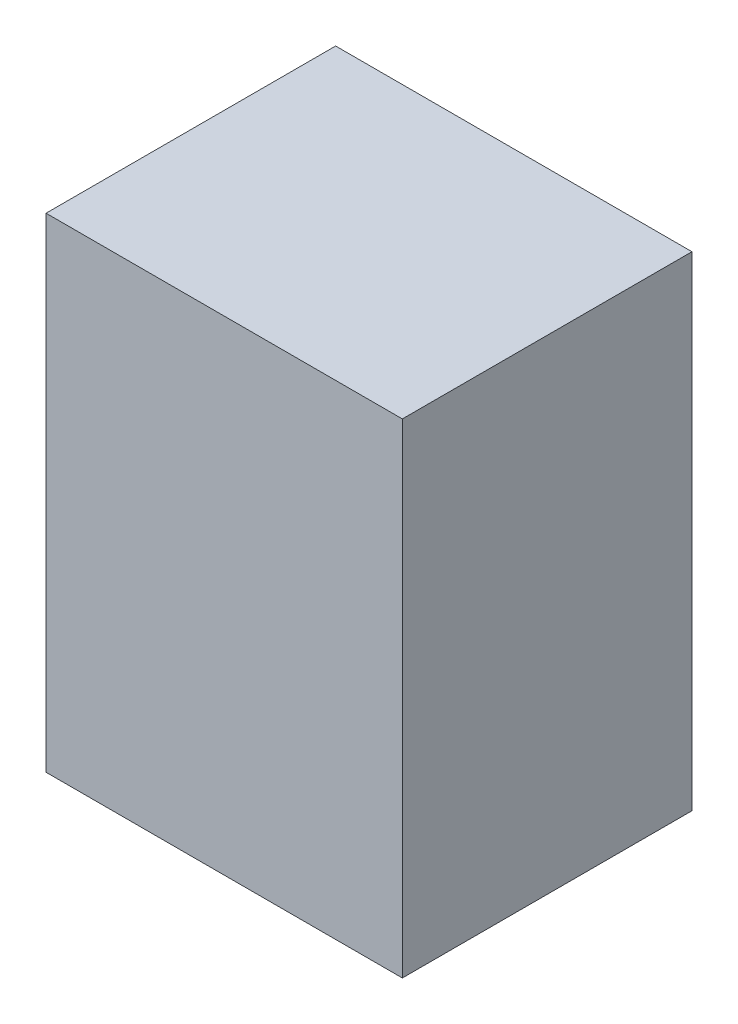
ISO-10303-21;
HEADER;
FILE_DESCRIPTION(('STEP AP214'),'2;1');
FILE_NAME('part.step','',(''),(''),'','','');
FILE_SCHEMA(('AUTOMOTIVE_DESIGN { 1 0 10303 214 1 1 1 1 }'));
ENDSEC;
DATA;
#1=APPLICATION_CONTEXT('core data for automotive mechanical design processes');
#2=APPLICATION_PROTOCOL_DEFINITION('international standard','automotive_design',2000,#1);
#3=PRODUCT_CONTEXT('',#1,'mechanical');
#4=PRODUCT('Part','Part','',(#3));
#5=PRODUCT_RELATED_PRODUCT_CATEGORY('part','',(#4));
#6=PRODUCT_DEFINITION_FORMATION('','',#4);
#7=PRODUCT_DEFINITION_CONTEXT('part definition',#1,'design');
#8=PRODUCT_DEFINITION('design','',#6,#7);
#9=PRODUCT_DEFINITION_SHAPE('','',#8);
#10=(LENGTH_UNIT() NAMED_UNIT(*) SI_UNIT(.MILLI.,.METRE.));
#11=(NAMED_UNIT(*) PLANE_ANGLE_UNIT() SI_UNIT($,.RADIAN.));
#12=(NAMED_UNIT(*) SI_UNIT($,.STERADIAN.) SOLID_ANGLE_UNIT());
#13=UNCERTAINTY_MEASURE_WITH_UNIT(LENGTH_MEASURE(1.E-05),#10,'distance_accuracy_value','');
#14=(GEOMETRIC_REPRESENTATION_CONTEXT(3) GLOBAL_UNCERTAINTY_ASSIGNED_CONTEXT((#13)) GLOBAL_UNIT_ASSIGNED_CONTEXT((#10,
#11,#12)) REPRESENTATION_CONTEXT('',''));
#15=CARTESIAN_POINT('',(0.,0.,0.));
#16=DIRECTION('',(0.,0.,1.));
#17=DIRECTION('',(1.,0.,0.));
#18=AXIS2_PLACEMENT_3D('',#15,#16,#17);
#19=CARTESIAN_POINT('',(7.86450000000038,-65.45,7.25));
#20=DIRECTION('',(1.,0.,0.));
#21=DIRECTION('',(0.,1.,0.));
#22=AXIS2_PLACEMENT_3D('',#19,#20,#21);
#23=PLANE('',#22);
#24=DIRECTION('',(0.,-1.,0.));
#25=VECTOR('',#24,1.);
#26=CARTESIAN_POINT('',(7.86450000000038,-65.45,0.));
#27=LINE('',#26,#25);
#28=CARTESIAN_POINT('',(7.86450000000038,-65.45,0.));
#29=VERTEX_POINT('',#28);
#30=CARTESIAN_POINT('',(7.86450000000038,-77.5714301256037,0.));
#31=VERTEX_POINT('',#30);
#32=EDGE_CURVE('E128',#29,#31,#27,.T.);
#33=ORIENTED_EDGE('',*,*,#32,.T.);
#34=DIRECTION('',(0.,0.,-1.));
#35=VECTOR('',#34,1.);
#36=CARTESIAN_POINT('',(7.86450000000038,-77.5714301256037,7.25));
#37=LINE('',#36,#35);
#38=CARTESIAN_POINT('',(7.86450000000038,-77.5714301256037,7.25));
#39=VERTEX_POINT('',#38);
#40=EDGE_CURVE('E11',#39,#31,#37,.T.);
#41=ORIENTED_EDGE('',*,*,#40,.F.);
#42=DIRECTION('',(0.,-1.,0.));
#43=VECTOR('',#42,1.);
#44=CARTESIAN_POINT('',(7.86450000000038,-65.45,7.25));
#45=LINE('',#44,#43);
#46=CARTESIAN_POINT('',(7.86450000000038,-65.45,7.25));
#47=VERTEX_POINT('',#46);
#48=EDGE_CURVE('E148',#47,#39,#45,.T.);
#49=ORIENTED_EDGE('',*,*,#48,.F.);
#50=DIRECTION('',(0.,0.,-1.));
#51=VECTOR('',#50,1.);
#52=CARTESIAN_POINT('',(7.86450000000038,-65.45,7.25));
#53=LINE('',#52,#51);
#54=EDGE_CURVE('E153',#47,#29,#53,.T.);
#55=ORIENTED_EDGE('',*,*,#54,.T.);
#56=EDGE_LOOP('',(#33,#41,#49,#55));
#57=FACE_BOUND('',#56,.T.);
#58=ADVANCED_FACE('F32',(#57),#23,.F.);
#59=CARTESIAN_POINT('',(7.86450000000038,-77.5714301256037,7.25));
#60=DIRECTION('',(0.,1.,0.));
#61=DIRECTION('',(0.,0.,1.));
#62=AXIS2_PLACEMENT_3D('',#59,#60,#61);
#63=PLANE('',#62);
#64=DIRECTION('',(1.,0.,0.));
#65=VECTOR('',#64,1.);
#66=CARTESIAN_POINT('',(7.86450000000038,-77.5714301256037,0.));
#67=LINE('',#66,#65);
#68=CARTESIAN_POINT('',(16.7845000000004,-77.5714301256037,0.));
#69=VERTEX_POINT('',#68);
#70=EDGE_CURVE('E132',#31,#69,#67,.T.);
#71=ORIENTED_EDGE('',*,*,#70,.T.);
#72=DIRECTION('',(0.,0.,-1.));
#73=VECTOR('',#72,1.);
#74=CARTESIAN_POINT('',(16.7845000000004,-77.5714301256037,7.25));
#75=LINE('',#74,#73);
#76=CARTESIAN_POINT('',(16.7845000000004,-77.5714301256037,7.25));
#77=VERTEX_POINT('',#76);
#78=EDGE_CURVE('E39',#77,#69,#75,.T.);
#79=ORIENTED_EDGE('',*,*,#78,.F.);
#80=DIRECTION('',(1.,0.,0.));
#81=VECTOR('',#80,1.);
#82=CARTESIAN_POINT('',(7.86450000000038,-77.5714301256037,7.25));
#83=LINE('',#82,#81);
#84=EDGE_CURVE('E83',#39,#77,#83,.T.);
#85=ORIENTED_EDGE('',*,*,#84,.F.);
#86=ORIENTED_EDGE('',*,*,#40,.T.);
#87=EDGE_LOOP('',(#71,#79,#85,#86));
#88=FACE_BOUND('',#87,.T.);
#89=ADVANCED_FACE('F182',(#88),#63,.F.);
#90=CARTESIAN_POINT('',(16.7845000000004,-65.45,7.25));
#91=DIRECTION('',(-1.,0.,0.));
#92=DIRECTION('',(0.,0.,1.));
#93=AXIS2_PLACEMENT_3D('',#90,#91,#92);
#94=PLANE('',#93);
#95=DIRECTION('',(0.,1.,0.));
#96=VECTOR('',#95,1.);
#97=CARTESIAN_POINT('',(16.7845000000004,-65.45,0.));
#98=LINE('',#97,#96);
#99=CARTESIAN_POINT('',(16.7845000000004,-65.45,0.));
#100=VERTEX_POINT('',#99);
#101=EDGE_CURVE('E156',#69,#100,#98,.T.);
#102=ORIENTED_EDGE('',*,*,#101,.T.);
#103=DIRECTION('',(0.,0.,-1.));
#104=VECTOR('',#103,1.);
#105=CARTESIAN_POINT('',(16.7845000000004,-65.45,7.25));
#106=LINE('',#105,#104);
#107=CARTESIAN_POINT('',(16.7845000000004,-65.45,7.25));
#108=VERTEX_POINT('',#107);
#109=EDGE_CURVE('E160',#108,#100,#106,.T.);
#110=ORIENTED_EDGE('',*,*,#109,.F.);
#111=DIRECTION('',(0.,1.,0.));
#112=VECTOR('',#111,1.);
#113=CARTESIAN_POINT('',(16.7845000000004,-65.45,7.25));
#114=LINE('',#113,#112);
#115=EDGE_CURVE('E151',#77,#108,#114,.T.);
#116=ORIENTED_EDGE('',*,*,#115,.F.);
#117=ORIENTED_EDGE('',*,*,#78,.T.);
#118=EDGE_LOOP('',(#102,#110,#116,#117));
#119=FACE_BOUND('',#118,.T.);
#120=ADVANCED_FACE('F165',(#119),#94,.F.);
#121=CARTESIAN_POINT('',(7.86450000000038,-65.45,7.25));
#122=DIRECTION('',(0.,-1.,0.));
#123=DIRECTION('',(0.,0.,-1.));
#124=AXIS2_PLACEMENT_3D('',#121,#122,#123);
#125=PLANE('',#124);
#126=DIRECTION('',(-1.,0.,0.));
#127=VECTOR('',#126,1.);
#128=CARTESIAN_POINT('',(7.86450000000038,-65.45,0.));
#129=LINE('',#128,#127);
#130=EDGE_CURVE('E76',#100,#29,#129,.T.);
#131=ORIENTED_EDGE('',*,*,#130,.T.);
#132=ORIENTED_EDGE('',*,*,#54,.F.);
#133=DIRECTION('',(-1.,0.,0.));
#134=VECTOR('',#133,1.);
#135=CARTESIAN_POINT('',(7.86450000000038,-65.45,7.25));
#136=LINE('',#135,#134);
#137=EDGE_CURVE('E55',#108,#47,#136,.T.);
#138=ORIENTED_EDGE('',*,*,#137,.F.);
#139=ORIENTED_EDGE('',*,*,#109,.T.);
#140=EDGE_LOOP('',(#131,#132,#138,#139));
#141=FACE_BOUND('',#140,.T.);
#142=ADVANCED_FACE('F173',(#141),#125,.F.);
#143=CARTESIAN_POINT('',(0.,0.,7.25));
#144=DIRECTION('',(0.,0.,1.));
#145=DIRECTION('',(1.,0.,0.));
#146=AXIS2_PLACEMENT_3D('',#143,#144,#145);
#147=PLANE('',#146);
#148=ORIENTED_EDGE('',*,*,#48,.T.);
#149=ORIENTED_EDGE('',*,*,#84,.T.);
#150=ORIENTED_EDGE('',*,*,#115,.T.);
#151=ORIENTED_EDGE('',*,*,#137,.T.);
#152=EDGE_LOOP('',(#148,#149,#150,#151));
#153=FACE_BOUND('',#152,.T.);
#154=ADVANCED_FACE('F175',(#153),#147,.T.);
#155=CARTESIAN_POINT('',(0.,0.,0.));
#156=DIRECTION('',(0.,0.,1.));
#157=DIRECTION('',(1.,0.,0.));
#158=AXIS2_PLACEMENT_3D('',#155,#156,#157);
#159=PLANE('',#158);
#160=DIRECTION('',(-1.,0.,0.));
#161=VECTOR('',#160,1.);
#162=CARTESIAN_POINT('',(7.86450000000038,-65.95,0.));
#163=LINE('',#162,#161);
#164=CARTESIAN_POINT('',(16.2845000000004,-65.95,0.));
#165=VERTEX_POINT('',#164);
#166=CARTESIAN_POINT('',(8.36450000000038,-65.95,0.));
#167=VERTEX_POINT('',#166);
#168=EDGE_CURVE('E123',#165,#167,#163,.T.);
#169=ORIENTED_EDGE('',*,*,#168,.T.);
#170=DIRECTION('',(0.,-1.,0.));
#171=VECTOR('',#170,1.);
#172=CARTESIAN_POINT('',(8.36450000000038,-65.45,0.));
#173=LINE('',#172,#171);
#174=CARTESIAN_POINT('',(8.36450000000038,-77.0714301256037,0.));
#175=VERTEX_POINT('',#174);
#176=EDGE_CURVE('E142',#167,#175,#173,.T.);
#177=ORIENTED_EDGE('',*,*,#176,.T.);
#178=DIRECTION('',(1.,0.,0.));
#179=VECTOR('',#178,1.);
#180=CARTESIAN_POINT('',(7.86450000000038,-77.0714301256037,0.));
#181=LINE('',#180,#179);
#182=CARTESIAN_POINT('',(16.2845000000004,-77.0714301256037,0.));
#183=VERTEX_POINT('',#182);
#184=EDGE_CURVE('E127',#175,#183,#181,.T.);
#185=ORIENTED_EDGE('',*,*,#184,.T.);
#186=DIRECTION('',(0.,1.,0.));
#187=VECTOR('',#186,1.);
#188=CARTESIAN_POINT('',(16.2845000000004,-65.45,0.));
#189=LINE('',#188,#187);
#190=EDGE_CURVE('E46',#183,#165,#189,.T.);
#191=ORIENTED_EDGE('',*,*,#190,.T.);
#192=EDGE_LOOP('',(#169,#177,#185,#191));
#193=FACE_BOUND('',#192,.T.);
#194=ORIENTED_EDGE('',*,*,#32,.F.);
#195=ORIENTED_EDGE('',*,*,#130,.F.);
#196=ORIENTED_EDGE('',*,*,#101,.F.);
#197=ORIENTED_EDGE('',*,*,#70,.F.);
#198=EDGE_LOOP('',(#194,#195,#196,#197));
#199=FACE_BOUND('',#198,.T.);
#200=ADVANCED_FACE('F169',(#193,#199),#159,.F.);
#201=CARTESIAN_POINT('',(8.36450000000038,-65.45,7.25));
#202=DIRECTION('',(1.,0.,0.));
#203=DIRECTION('',(0.,1.,0.));
#204=AXIS2_PLACEMENT_3D('',#201,#202,#203);
#205=PLANE('',#204);
#206=ORIENTED_EDGE('',*,*,#176,.F.);
#207=DIRECTION('',(0.,0.,-1.));
#208=VECTOR('',#207,1.);
#209=CARTESIAN_POINT('',(8.36450000000038,-65.95,7.25));
#210=LINE('',#209,#208);
#211=CARTESIAN_POINT('',(8.36450000000038,-65.95,7.05));
#212=VERTEX_POINT('',#211);
#213=EDGE_CURVE('E122',#212,#167,#210,.T.);
#214=ORIENTED_EDGE('',*,*,#213,.F.);
#215=DIRECTION('',(0.,-1.,0.));
#216=VECTOR('',#215,1.);
#217=CARTESIAN_POINT('',(8.36450000000038,-65.45,7.05));
#218=LINE('',#217,#216);
#219=CARTESIAN_POINT('',(8.36450000000038,-77.0714301256037,7.05));
#220=VERTEX_POINT('',#219);
#221=EDGE_CURVE('E110',#212,#220,#218,.T.);
#222=ORIENTED_EDGE('',*,*,#221,.T.);
#223=DIRECTION('',(0.,0.,-1.));
#224=VECTOR('',#223,1.);
#225=CARTESIAN_POINT('',(8.36450000000038,-77.0714301256037,7.25));
#226=LINE('',#225,#224);
#227=EDGE_CURVE('E120',#220,#175,#226,.T.);
#228=ORIENTED_EDGE('',*,*,#227,.T.);
#229=EDGE_LOOP('',(#206,#214,#222,#228));
#230=FACE_BOUND('',#229,.T.);
#231=ADVANCED_FACE('F119',(#230),#205,.T.);
#232=CARTESIAN_POINT('',(7.86450000000038,-77.0714301256037,7.25));
#233=DIRECTION('',(0.,1.,0.));
#234=DIRECTION('',(0.,0.,1.));
#235=AXIS2_PLACEMENT_3D('',#232,#233,#234);
#236=PLANE('',#235);
#237=ORIENTED_EDGE('',*,*,#184,.F.);
#238=ORIENTED_EDGE('',*,*,#227,.F.);
#239=DIRECTION('',(1.,0.,0.));
#240=VECTOR('',#239,1.);
#241=CARTESIAN_POINT('',(7.86450000000038,-77.0714301256037,7.05));
#242=LINE('',#241,#240);
#243=CARTESIAN_POINT('',(16.2845000000004,-77.0714301256037,7.05));
#244=VERTEX_POINT('',#243);
#245=EDGE_CURVE('E106',#220,#244,#242,.T.);
#246=ORIENTED_EDGE('',*,*,#245,.T.);
#247=DIRECTION('',(0.,0.,-1.));
#248=VECTOR('',#247,1.);
#249=CARTESIAN_POINT('',(16.2845000000004,-77.0714301256037,7.25));
#250=LINE('',#249,#248);
#251=EDGE_CURVE('E129',#244,#183,#250,.T.);
#252=ORIENTED_EDGE('',*,*,#251,.T.);
#253=EDGE_LOOP('',(#237,#238,#246,#252));
#254=FACE_BOUND('',#253,.T.);
#255=ADVANCED_FACE('F125',(#254),#236,.T.);
#256=CARTESIAN_POINT('',(16.2845000000004,-65.45,7.25));
#257=DIRECTION('',(-1.,0.,0.));
#258=DIRECTION('',(0.,0.,1.));
#259=AXIS2_PLACEMENT_3D('',#256,#257,#258);
#260=PLANE('',#259);
#261=ORIENTED_EDGE('',*,*,#190,.F.);
#262=ORIENTED_EDGE('',*,*,#251,.F.);
#263=DIRECTION('',(0.,1.,0.));
#264=VECTOR('',#263,1.);
#265=CARTESIAN_POINT('',(16.2845000000004,-65.45,7.05));
#266=LINE('',#265,#264);
#267=CARTESIAN_POINT('',(16.2845000000004,-65.95,7.05));
#268=VERTEX_POINT('',#267);
#269=EDGE_CURVE('E111',#244,#268,#266,.T.);
#270=ORIENTED_EDGE('',*,*,#269,.T.);
#271=DIRECTION('',(0.,0.,-1.));
#272=VECTOR('',#271,1.);
#273=CARTESIAN_POINT('',(16.2845000000004,-65.95,7.25));
#274=LINE('',#273,#272);
#275=EDGE_CURVE('E134',#268,#165,#274,.T.);
#276=ORIENTED_EDGE('',*,*,#275,.T.);
#277=EDGE_LOOP('',(#261,#262,#270,#276));
#278=FACE_BOUND('',#277,.T.);
#279=ADVANCED_FACE('F230',(#278),#260,.T.);
#280=CARTESIAN_POINT('',(7.86450000000038,-65.95,7.25));
#281=DIRECTION('',(0.,-1.,0.));
#282=DIRECTION('',(0.,0.,-1.));
#283=AXIS2_PLACEMENT_3D('',#280,#281,#282);
#284=PLANE('',#283);
#285=ORIENTED_EDGE('',*,*,#168,.F.);
#286=ORIENTED_EDGE('',*,*,#275,.F.);
#287=DIRECTION('',(-1.,0.,0.));
#288=VECTOR('',#287,1.);
#289=CARTESIAN_POINT('',(7.86450000000038,-65.95,7.05));
#290=LINE('',#289,#288);
#291=EDGE_CURVE('E137',#268,#212,#290,.T.);
#292=ORIENTED_EDGE('',*,*,#291,.T.);
#293=ORIENTED_EDGE('',*,*,#213,.T.);
#294=EDGE_LOOP('',(#285,#286,#292,#293));
#295=FACE_BOUND('',#294,.T.);
#296=ADVANCED_FACE('F239',(#295),#284,.T.);
#297=CARTESIAN_POINT('',(0.,0.,7.05));
#298=DIRECTION('',(0.,0.,1.));
#299=DIRECTION('',(1.,0.,0.));
#300=AXIS2_PLACEMENT_3D('',#297,#298,#299);
#301=PLANE('',#300);
#302=ORIENTED_EDGE('',*,*,#221,.F.);
#303=ORIENTED_EDGE('',*,*,#291,.F.);
#304=ORIENTED_EDGE('',*,*,#269,.F.);
#305=ORIENTED_EDGE('',*,*,#245,.F.);
#306=EDGE_LOOP('',(#302,#303,#304,#305));
#307=FACE_BOUND('',#306,.T.);
#308=ADVANCED_FACE('F108',(#307),#301,.F.);
#309=CLOSED_SHELL('',(#58,#89,#120,#142,#154,#200,#231,#255,#279,#296,#308));
#310=MANIFOLD_SOLID_BREP('B2',#309);
#311=ADVANCED_BREP_SHAPE_REPRESENTATION('',(#18,#310),#14);
#312=SHAPE_DEFINITION_REPRESENTATION(#9,#311);
ENDSEC;
END-ISO-10303-21;
